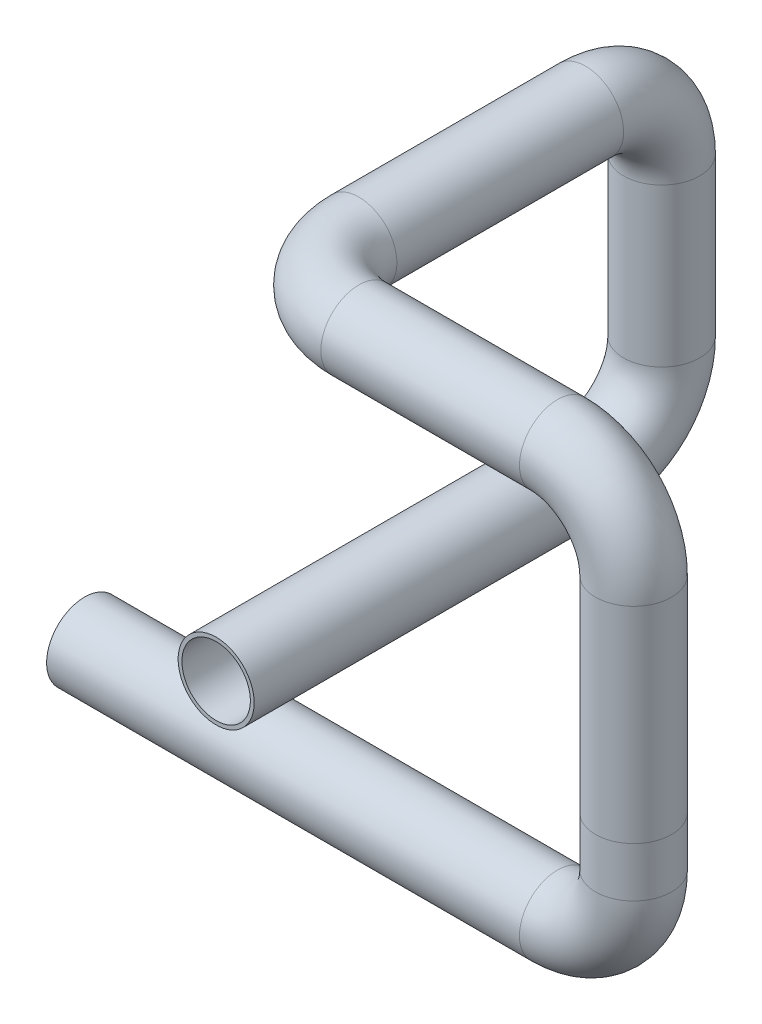
ISO-10303-21;
HEADER;
FILE_DESCRIPTION(('STEP AP214'),'2;1');
FILE_NAME('part.step','',(''),(''),'','','');
FILE_SCHEMA(('AUTOMOTIVE_DESIGN { 1 0 10303 214 1 1 1 1 }'));
ENDSEC;
DATA;
#1=APPLICATION_CONTEXT('core data for automotive mechanical design processes');
#2=APPLICATION_PROTOCOL_DEFINITION('international standard','automotive_design',2000,#1);
#3=PRODUCT_CONTEXT('',#1,'mechanical');
#4=PRODUCT('Part','Part','',(#3));
#5=PRODUCT_RELATED_PRODUCT_CATEGORY('part','',(#4));
#6=PRODUCT_DEFINITION_FORMATION('','',#4);
#7=PRODUCT_DEFINITION_CONTEXT('part definition',#1,'design');
#8=PRODUCT_DEFINITION('design','',#6,#7);
#9=PRODUCT_DEFINITION_SHAPE('','',#8);
#10=(LENGTH_UNIT() NAMED_UNIT(*) SI_UNIT(.MILLI.,.METRE.));
#11=(NAMED_UNIT(*) PLANE_ANGLE_UNIT() SI_UNIT($,.RADIAN.));
#12=(NAMED_UNIT(*) SI_UNIT($,.STERADIAN.) SOLID_ANGLE_UNIT());
#13=UNCERTAINTY_MEASURE_WITH_UNIT(LENGTH_MEASURE(1.E-05),#10,'distance_accuracy_value','');
#14=(GEOMETRIC_REPRESENTATION_CONTEXT(3) GLOBAL_UNCERTAINTY_ASSIGNED_CONTEXT((#13)) GLOBAL_UNIT_ASSIGNED_CONTEXT((#10,
#11,#12)) REPRESENTATION_CONTEXT('',''));
#15=CARTESIAN_POINT('',(0.,0.,0.));
#16=DIRECTION('',(0.,0.,1.));
#17=DIRECTION('',(1.,0.,0.));
#18=AXIS2_PLACEMENT_3D('',#15,#16,#17);
#19=CARTESIAN_POINT('',(0.,0.,0.));
#20=DIRECTION('',(0.,0.,-1.));
#21=DIRECTION('',(0.,1.,0.));
#22=AXIS2_PLACEMENT_3D('',#19,#20,#21);
#23=PLANE('',#22);
#24=CARTESIAN_POINT('',(0.,0.,0.));
#25=DIRECTION('',(0.,0.,-1.));
#26=DIRECTION('',(0.,1.,0.));
#27=AXIS2_PLACEMENT_3D('',#24,#25,#26);
#28=CIRCLE('',#27,4.5);
#29=CARTESIAN_POINT('',(0.,4.5,0.));
#30=VERTEX_POINT('',#29);
#31=EDGE_CURVE('E117',#30,#30,#28,.T.);
#32=ORIENTED_EDGE('',*,*,#31,.T.);
#33=EDGE_LOOP('',(#32));
#34=FACE_BOUND('',#33,.T.);
#35=CARTESIAN_POINT('',(0.,0.,0.));
#36=DIRECTION('',(0.,0.,-1.));
#37=DIRECTION('',(0.,1.,0.));
#38=AXIS2_PLACEMENT_3D('',#35,#36,#37);
#39=CIRCLE('',#38,5.);
#40=CARTESIAN_POINT('',(0.,5.,0.));
#41=VERTEX_POINT('',#40);
#42=EDGE_CURVE('E108',#41,#41,#39,.T.);
#43=ORIENTED_EDGE('',*,*,#42,.F.);
#44=EDGE_LOOP('',(#43));
#45=FACE_BOUND('',#44,.T.);
#46=ADVANCED_FACE('F53',(#34,#45),#23,.F.);
#47=CARTESIAN_POINT('',(-26.0470045787997,-12.8350139714826,-8.76048561855214));
#48=DIRECTION('',(-1.,0.,0.));
#49=DIRECTION('',(0.,1.,0.));
#50=AXIS2_PLACEMENT_3D('',#47,#48,#49);
#51=PLANE('',#50);
#52=CARTESIAN_POINT('',(-26.0470045787997,-12.8350139714826,-8.76048561855214));
#53=DIRECTION('',(-1.,0.,0.));
#54=DIRECTION('',(0.,-1.,0.));
#55=AXIS2_PLACEMENT_3D('',#52,#53,#54);
#56=CIRCLE('',#55,4.5);
#57=CARTESIAN_POINT('',(-26.0470045787997,-17.3350139714826,-8.76048561855214));
#58=VERTEX_POINT('',#57);
#59=EDGE_CURVE('E112',#58,#58,#56,.T.);
#60=ORIENTED_EDGE('',*,*,#59,.F.);
#61=EDGE_LOOP('',(#60));
#62=FACE_BOUND('',#61,.T.);
#63=CARTESIAN_POINT('',(-26.0470045787997,-12.8350139714826,-8.76048561855214));
#64=DIRECTION('',(-1.,0.,0.));
#65=DIRECTION('',(0.,1.,0.));
#66=AXIS2_PLACEMENT_3D('',#63,#64,#65);
#67=CIRCLE('',#66,5.);
#68=CARTESIAN_POINT('',(-26.0470045787997,-7.83501397148257,-8.76048561855214));
#69=VERTEX_POINT('',#68);
#70=EDGE_CURVE('E11',#69,#69,#67,.T.);
#71=ORIENTED_EDGE('',*,*,#70,.T.);
#72=EDGE_LOOP('',(#71));
#73=FACE_BOUND('',#72,.T.);
#74=ADVANCED_FACE('F193',(#62,#73),#51,.T.);
#75=CARTESIAN_POINT('',(0.,0.,0.));
#76=DIRECTION('',(0.,0.,-1.));
#77=DIRECTION('',(0.,1.,0.));
#78=AXIS2_PLACEMENT_3D('',#75,#76,#77);
#79=CYLINDRICAL_SURFACE('',#78,5.);
#80=CARTESIAN_POINT('',(0.,0.,-48.5618707582967));
#81=DIRECTION('',(0.,0.,-1.));
#82=DIRECTION('',(0.,1.,0.));
#83=AXIS2_PLACEMENT_3D('',#80,#81,#82);
#84=CIRCLE('',#83,5.);
#85=CARTESIAN_POINT('',(0.,-5.,-48.5618707582967));
#86=VERTEX_POINT('',#85);
#87=EDGE_CURVE('E104',#86,#86,#84,.T.);
#88=ORIENTED_EDGE('',*,*,#87,.F.);
#89=EDGE_LOOP('',(#88));
#90=FACE_BOUND('',#89,.T.);
#91=ORIENTED_EDGE('',*,*,#42,.T.);
#92=EDGE_LOOP('',(#91));
#93=FACE_BOUND('',#92,.T.);
#94=ADVANCED_FACE('F195',(#90,#93),#79,.T.);
#95=CARTESIAN_POINT('',(0.,10.,-48.5618707582967));
#96=DIRECTION('',(1.,0.,0.));
#97=DIRECTION('',(0.,0.,-1.));
#98=AXIS2_PLACEMENT_3D('',#95,#96,#97);
#99=TOROIDAL_SURFACE('',#98,10.,5.);
#100=CARTESIAN_POINT('',(0.,10.,-58.5618707582967));
#101=DIRECTION('',(0.,1.,0.));
#102=DIRECTION('',(0.,0.,1.));
#103=AXIS2_PLACEMENT_3D('',#100,#101,#102);
#104=CIRCLE('',#103,5.);
#105=CARTESIAN_POINT('',(0.,10.,-63.5618707582967));
#106=VERTEX_POINT('',#105);
#107=EDGE_CURVE('E100',#106,#106,#104,.T.);
#108=CARTESIAN_POINT('',(0.,10.,-48.5618707582967));
#109=DIRECTION('',(1.,0.,0.));
#110=DIRECTION('',(0.,0.,-1.));
#111=AXIS2_PLACEMENT_3D('',#108,#109,#110);
#112=CIRCLE('',#111,15.);
#113=EDGE_CURVE('',#86,#106,#112,.T.);
#114=ORIENTED_EDGE('',*,*,#87,.T.);
#115=ORIENTED_EDGE('',*,*,#107,.F.);
#116=ORIENTED_EDGE('',*,*,#113,.T.);
#117=ORIENTED_EDGE('',*,*,#113,.F.);
#118=EDGE_LOOP('',(#114,#116,#115,#117));
#119=FACE_BOUND('',#118,.T.);
#120=ADVANCED_FACE('F201',(#119),#99,.T.);
#121=CARTESIAN_POINT('',(0.,10.,-58.5618707582967));
#122=DIRECTION('',(0.,1.,0.));
#123=DIRECTION('',(0.,0.,1.));
#124=AXIS2_PLACEMENT_3D('',#121,#122,#123);
#125=CYLINDRICAL_SURFACE('',#124,5.);
#126=CARTESIAN_POINT('',(0.,30.7185739143756,-58.5618707582967));
#127=DIRECTION('',(0.,1.,0.));
#128=DIRECTION('',(0.,0.,1.));
#129=AXIS2_PLACEMENT_3D('',#126,#127,#128);
#130=CIRCLE('',#129,5.);
#131=CARTESIAN_POINT('',(0.,30.7185739143756,-63.5618707582967));
#132=VERTEX_POINT('',#131);
#133=EDGE_CURVE('E96',#132,#132,#130,.T.);
#134=ORIENTED_EDGE('',*,*,#133,.F.);
#135=EDGE_LOOP('',(#134));
#136=FACE_BOUND('',#135,.T.);
#137=ORIENTED_EDGE('',*,*,#107,.T.);
#138=EDGE_LOOP('',(#137));
#139=FACE_BOUND('',#138,.T.);
#140=ADVANCED_FACE('F266',(#136,#139),#125,.T.);
#141=CARTESIAN_POINT('',(0.,30.7185739143756,-48.5618707582967));
#142=DIRECTION('',(1.,0.,0.));
#143=DIRECTION('',(0.,0.,-1.));
#144=AXIS2_PLACEMENT_3D('',#141,#142,#143);
#145=TOROIDAL_SURFACE('',#144,10.,5.);
#146=CARTESIAN_POINT('',(0.,40.7185739143756,-48.5618707582967));
#147=DIRECTION('',(0.,0.,1.));
#148=DIRECTION('',(0.,-1.,0.));
#149=AXIS2_PLACEMENT_3D('',#146,#147,#148);
#150=CIRCLE('',#149,5.);
#151=CARTESIAN_POINT('',(0.,45.7185739143756,-48.5618707582967));
#152=VERTEX_POINT('',#151);
#153=EDGE_CURVE('E92',#152,#152,#150,.T.);
#154=CARTESIAN_POINT('',(0.,30.7185739143756,-48.5618707582967));
#155=DIRECTION('',(1.,0.,0.));
#156=DIRECTION('',(0.,0.,-1.));
#157=AXIS2_PLACEMENT_3D('',#154,#155,#156);
#158=CIRCLE('',#157,15.);
#159=EDGE_CURVE('',#132,#152,#158,.T.);
#160=ORIENTED_EDGE('',*,*,#133,.T.);
#161=ORIENTED_EDGE('',*,*,#153,.F.);
#162=ORIENTED_EDGE('',*,*,#159,.T.);
#163=ORIENTED_EDGE('',*,*,#159,.F.);
#164=EDGE_LOOP('',(#160,#162,#161,#163));
#165=FACE_BOUND('',#164,.T.);
#166=ADVANCED_FACE('F270',(#165),#145,.T.);
#167=CARTESIAN_POINT('',(0.,40.7185739143756,-48.5618707582967));
#168=DIRECTION('',(0.,0.,1.));
#169=DIRECTION('',(1.,0.,0.));
#170=AXIS2_PLACEMENT_3D('',#167,#168,#169);
#171=CYLINDRICAL_SURFACE('',#170,5.);
#172=CARTESIAN_POINT('',(0.,40.7185739143756,-18.7604856185521));
#173=DIRECTION('',(0.,0.,1.));
#174=DIRECTION('',(0.,-1.,0.));
#175=AXIS2_PLACEMENT_3D('',#172,#173,#174);
#176=CIRCLE('',#175,5.);
#177=CARTESIAN_POINT('',(-5.,40.7185739143756,-18.7604856185521));
#178=VERTEX_POINT('',#177);
#179=EDGE_CURVE('E88',#178,#178,#176,.T.);
#180=ORIENTED_EDGE('',*,*,#179,.F.);
#181=EDGE_LOOP('',(#180));
#182=FACE_BOUND('',#181,.T.);
#183=ORIENTED_EDGE('',*,*,#153,.T.);
#184=EDGE_LOOP('',(#183));
#185=FACE_BOUND('',#184,.T.);
#186=ADVANCED_FACE('F274',(#182,#185),#171,.T.);
#187=CARTESIAN_POINT('',(10.,40.7185739143756,-18.7604856185521));
#188=DIRECTION('',(0.,1.,0.));
#189=DIRECTION('',(0.,0.,1.));
#190=AXIS2_PLACEMENT_3D('',#187,#188,#189);
#191=TOROIDAL_SURFACE('',#190,10.,5.);
#192=CARTESIAN_POINT('',(10.,40.7185739143756,-8.76048561855214));
#193=DIRECTION('',(1.,0.,0.));
#194=DIRECTION('',(0.,-1.,0.));
#195=AXIS2_PLACEMENT_3D('',#192,#193,#194);
#196=CIRCLE('',#195,5.);
#197=CARTESIAN_POINT('',(10.,40.7185739143756,-3.76048561855214));
#198=VERTEX_POINT('',#197);
#199=EDGE_CURVE('E84',#198,#198,#196,.T.);
#200=CARTESIAN_POINT('',(10.,40.7185739143756,-18.7604856185521));
#201=DIRECTION('',(0.,1.,0.));
#202=DIRECTION('',(0.,0.,1.));
#203=AXIS2_PLACEMENT_3D('',#200,#201,#202);
#204=CIRCLE('',#203,15.);
#205=EDGE_CURVE('',#178,#198,#204,.T.);
#206=ORIENTED_EDGE('',*,*,#179,.T.);
#207=ORIENTED_EDGE('',*,*,#199,.F.);
#208=ORIENTED_EDGE('',*,*,#205,.T.);
#209=ORIENTED_EDGE('',*,*,#205,.F.);
#210=EDGE_LOOP('',(#206,#208,#207,#209));
#211=FACE_BOUND('',#210,.T.);
#212=ADVANCED_FACE('F278',(#211),#191,.T.);
#213=CARTESIAN_POINT('',(10.,40.7185739143756,-8.76048561855214));
#214=DIRECTION('',(1.,0.,0.));
#215=DIRECTION('',(0.,0.,-1.));
#216=AXIS2_PLACEMENT_3D('',#213,#214,#215);
#217=CYLINDRICAL_SURFACE('',#216,5.);
#218=CARTESIAN_POINT('',(36.112465609383,40.7185739143756,-8.76048561855214));
#219=DIRECTION('',(1.,0.,0.));
#220=DIRECTION('',(0.,-1.,0.));
#221=AXIS2_PLACEMENT_3D('',#218,#219,#220);
#222=CIRCLE('',#221,5.);
#223=CARTESIAN_POINT('',(36.112465609383,45.7185739143756,-8.76048561855214));
#224=VERTEX_POINT('',#223);
#225=EDGE_CURVE('E80',#224,#224,#222,.T.);
#226=ORIENTED_EDGE('',*,*,#225,.F.);
#227=EDGE_LOOP('',(#226));
#228=FACE_BOUND('',#227,.T.);
#229=ORIENTED_EDGE('',*,*,#199,.T.);
#230=EDGE_LOOP('',(#229));
#231=FACE_BOUND('',#230,.T.);
#232=ADVANCED_FACE('F282',(#228,#231),#217,.T.);
#233=CARTESIAN_POINT('',(36.112465609383,30.7185739143756,-8.76048561855214));
#234=DIRECTION('',(0.,0.,-1.));
#235=DIRECTION('',(-1.,0.,0.));
#236=AXIS2_PLACEMENT_3D('',#233,#234,#235);
#237=TOROIDAL_SURFACE('',#236,10.,5.);
#238=CARTESIAN_POINT('',(46.112465609383,30.7185739143756,-8.76048561855214));
#239=DIRECTION('',(0.,-1.,0.));
#240=DIRECTION('',(-1.,0.,0.));
#241=AXIS2_PLACEMENT_3D('',#238,#239,#240);
#242=CIRCLE('',#241,5.);
#243=CARTESIAN_POINT('',(51.112465609383,30.7185739143756,-8.76048561855214));
#244=VERTEX_POINT('',#243);
#245=EDGE_CURVE('E76',#244,#244,#242,.T.);
#246=CARTESIAN_POINT('',(36.112465609383,30.7185739143756,-8.76048561855214));
#247=DIRECTION('',(0.,0.,-1.));
#248=DIRECTION('',(-1.,0.,0.));
#249=AXIS2_PLACEMENT_3D('',#246,#247,#248);
#250=CIRCLE('',#249,15.);
#251=EDGE_CURVE('',#224,#244,#250,.T.);
#252=ORIENTED_EDGE('',*,*,#225,.T.);
#253=ORIENTED_EDGE('',*,*,#245,.F.);
#254=ORIENTED_EDGE('',*,*,#251,.T.);
#255=ORIENTED_EDGE('',*,*,#251,.F.);
#256=EDGE_LOOP('',(#252,#254,#253,#255));
#257=FACE_BOUND('',#256,.T.);
#258=ADVANCED_FACE('F286',(#257),#237,.T.);
#259=CARTESIAN_POINT('',(46.112465609383,30.7185739143756,-8.76048561855214));
#260=DIRECTION('',(0.,-1.,0.));
#261=DIRECTION('',(0.,0.,-1.));
#262=AXIS2_PLACEMENT_3D('',#259,#260,#261);
#263=CYLINDRICAL_SURFACE('',#262,5.);
#264=CARTESIAN_POINT('',(46.112465609383,3.70351457729612,-8.76048561855214));
#265=DIRECTION('',(0.,-1.,0.));
#266=DIRECTION('',(-1.,0.,0.));
#267=AXIS2_PLACEMENT_3D('',#264,#265,#266);
#268=CIRCLE('',#267,5.);
#269=CARTESIAN_POINT('',(41.112465609383,3.70351457729612,-8.76048561855214));
#270=VERTEX_POINT('',#269);
#271=EDGE_CURVE('E70',#270,#270,#268,.T.);
#272=ORIENTED_EDGE('',*,*,#271,.F.);
#273=EDGE_LOOP('',(#272));
#274=FACE_BOUND('',#273,.T.);
#275=ORIENTED_EDGE('',*,*,#245,.T.);
#276=EDGE_LOOP('',(#275));
#277=FACE_BOUND('',#276,.T.);
#278=ADVANCED_FACE('F290',(#274,#277),#263,.T.);
#279=CARTESIAN_POINT('',(46.112465609383,3.70351457729612,-8.76048561855214));
#280=DIRECTION('',(0.,-1.,0.));
#281=DIRECTION('',(0.,0.,-1.));
#282=AXIS2_PLACEMENT_3D('',#279,#280,#281);
#283=CYLINDRICAL_SURFACE('',#282,5.);
#284=CARTESIAN_POINT('',(46.112465609383,-2.83501397148257,-8.76048561855214));
#285=DIRECTION('',(0.,-1.,0.));
#286=DIRECTION('',(-1.,0.,0.));
#287=AXIS2_PLACEMENT_3D('',#284,#285,#286);
#288=CIRCLE('',#287,5.);
#289=CARTESIAN_POINT('',(51.112465609383,-2.83501397148257,-8.76048561855214));
#290=VERTEX_POINT('',#289);
#291=EDGE_CURVE('E65',#290,#290,#288,.T.);
#292=ORIENTED_EDGE('',*,*,#291,.F.);
#293=EDGE_LOOP('',(#292));
#294=FACE_BOUND('',#293,.T.);
#295=ORIENTED_EDGE('',*,*,#271,.T.);
#296=EDGE_LOOP('',(#295));
#297=FACE_BOUND('',#296,.T.);
#298=ADVANCED_FACE('F189',(#294,#297),#283,.T.);
#299=CARTESIAN_POINT('',(36.112465609383,-2.83501397148257,-8.76048561855214));
#300=DIRECTION('',(0.,0.,-1.));
#301=DIRECTION('',(-1.,0.,0.));
#302=AXIS2_PLACEMENT_3D('',#299,#300,#301);
#303=TOROIDAL_SURFACE('',#302,10.,5.);
#304=CARTESIAN_POINT('',(36.112465609383,-12.8350139714826,-8.76048561855214));
#305=DIRECTION('',(-1.,0.,0.));
#306=DIRECTION('',(0.,1.,0.));
#307=AXIS2_PLACEMENT_3D('',#304,#305,#306);
#308=CIRCLE('',#307,5.);
#309=CARTESIAN_POINT('',(36.112465609383,-17.8350139714826,-8.76048561855214));
#310=VERTEX_POINT('',#309);
#311=EDGE_CURVE('E60',#310,#310,#308,.T.);
#312=CARTESIAN_POINT('',(36.112465609383,-2.83501397148257,-8.76048561855214));
#313=DIRECTION('',(0.,0.,-1.));
#314=DIRECTION('',(-1.,0.,0.));
#315=AXIS2_PLACEMENT_3D('',#312,#313,#314);
#316=CIRCLE('',#315,15.);
#317=EDGE_CURVE('',#290,#310,#316,.T.);
#318=ORIENTED_EDGE('',*,*,#291,.T.);
#319=ORIENTED_EDGE('',*,*,#311,.F.);
#320=ORIENTED_EDGE('',*,*,#317,.T.);
#321=ORIENTED_EDGE('',*,*,#317,.F.);
#322=EDGE_LOOP('',(#318,#320,#319,#321));
#323=FACE_BOUND('',#322,.T.);
#324=ADVANCED_FACE('F183',(#323),#303,.T.);
#325=CARTESIAN_POINT('',(36.112465609383,-12.8350139714826,-8.76048561855214));
#326=DIRECTION('',(-1.,0.,0.));
#327=DIRECTION('',(0.,0.,1.));
#328=AXIS2_PLACEMENT_3D('',#325,#326,#327);
#329=CYLINDRICAL_SURFACE('',#328,5.);
#330=ORIENTED_EDGE('',*,*,#70,.F.);
#331=EDGE_LOOP('',(#330));
#332=FACE_BOUND('',#331,.T.);
#333=ORIENTED_EDGE('',*,*,#311,.T.);
#334=EDGE_LOOP('',(#333));
#335=FACE_BOUND('',#334,.T.);
#336=ADVANCED_FACE('F180',(#332,#335),#329,.T.);
#337=CARTESIAN_POINT('',(0.,0.,0.));
#338=DIRECTION('',(0.,0.,-1.));
#339=DIRECTION('',(0.,1.,0.));
#340=AXIS2_PLACEMENT_3D('',#337,#338,#339);
#341=CYLINDRICAL_SURFACE('',#340,4.5);
#342=CARTESIAN_POINT('',(0.,0.,-48.5618707582967));
#343=DIRECTION('',(0.,0.,1.));
#344=DIRECTION('',(0.,-1.,0.));
#345=AXIS2_PLACEMENT_3D('',#342,#343,#344);
#346=CIRCLE('',#345,4.5);
#347=CARTESIAN_POINT('',(0.,-4.5,-48.5618707582967));
#348=VERTEX_POINT('',#347);
#349=EDGE_CURVE('E121',#348,#348,#346,.F.);
#350=ORIENTED_EDGE('',*,*,#349,.T.);
#351=EDGE_LOOP('',(#350));
#352=FACE_BOUND('',#351,.T.);
#353=ORIENTED_EDGE('',*,*,#31,.F.);
#354=EDGE_LOOP('',(#353));
#355=FACE_BOUND('',#354,.T.);
#356=ADVANCED_FACE('F165',(#352,#355),#341,.F.);
#357=CARTESIAN_POINT('',(0.,10.,-48.5618707582967));
#358=DIRECTION('',(1.,0.,0.));
#359=DIRECTION('',(0.,0.,-1.));
#360=AXIS2_PLACEMENT_3D('',#357,#358,#359);
#361=TOROIDAL_SURFACE('',#360,10.,4.5);
#362=CARTESIAN_POINT('',(0.,10.,-58.5618707582967));
#363=DIRECTION('',(0.,1.,0.));
#364=DIRECTION('',(0.,0.,1.));
#365=AXIS2_PLACEMENT_3D('',#362,#363,#364);
#366=CIRCLE('',#365,4.5);
#367=CARTESIAN_POINT('',(0.,10.,-63.0618707582967));
#368=VERTEX_POINT('',#367);
#369=EDGE_CURVE('E157',#368,#368,#366,.T.);
#370=CARTESIAN_POINT('',(0.,10.,-48.5618707582967));
#371=DIRECTION('',(1.,0.,0.));
#372=DIRECTION('',(0.,0.,-1.));
#373=AXIS2_PLACEMENT_3D('',#370,#371,#372);
#374=CIRCLE('',#373,14.5);
#375=EDGE_CURVE('',#348,#368,#374,.T.);
#376=ORIENTED_EDGE('',*,*,#349,.F.);
#377=ORIENTED_EDGE('',*,*,#369,.T.);
#378=ORIENTED_EDGE('',*,*,#375,.T.);
#379=ORIENTED_EDGE('',*,*,#375,.F.);
#380=EDGE_LOOP('',(#376,#378,#377,#379));
#381=FACE_BOUND('',#380,.T.);
#382=ADVANCED_FACE('F168',(#381),#361,.F.);
#383=CARTESIAN_POINT('',(0.,10.,-58.5618707582967));
#384=DIRECTION('',(0.,1.,0.));
#385=DIRECTION('',(0.,0.,1.));
#386=AXIS2_PLACEMENT_3D('',#383,#384,#385);
#387=CYLINDRICAL_SURFACE('',#386,4.5);
#388=CARTESIAN_POINT('',(0.,30.7185739143756,-58.5618707582967));
#389=DIRECTION('',(0.,-1.,0.));
#390=DIRECTION('',(0.,0.,-1.));
#391=AXIS2_PLACEMENT_3D('',#388,#389,#390);
#392=CIRCLE('',#391,4.5);
#393=CARTESIAN_POINT('',(0.,30.7185739143756,-63.0618707582967));
#394=VERTEX_POINT('',#393);
#395=EDGE_CURVE('E153',#394,#394,#392,.F.);
#396=ORIENTED_EDGE('',*,*,#395,.T.);
#397=EDGE_LOOP('',(#396));
#398=FACE_BOUND('',#397,.T.);
#399=ORIENTED_EDGE('',*,*,#369,.F.);
#400=EDGE_LOOP('',(#399));
#401=FACE_BOUND('',#400,.T.);
#402=ADVANCED_FACE('F170',(#398,#401),#387,.F.);
#403=CARTESIAN_POINT('',(0.,30.7185739143756,-48.5618707582967));
#404=DIRECTION('',(1.,0.,0.));
#405=DIRECTION('',(0.,0.,-1.));
#406=AXIS2_PLACEMENT_3D('',#403,#404,#405);
#407=TOROIDAL_SURFACE('',#406,10.,4.5);
#408=CARTESIAN_POINT('',(0.,40.7185739143756,-48.5618707582967));
#409=DIRECTION('',(0.,0.,1.));
#410=DIRECTION('',(1.,0.,0.));
#411=AXIS2_PLACEMENT_3D('',#408,#409,#410);
#412=CIRCLE('',#411,4.5);
#413=CARTESIAN_POINT('',(0.,45.2185739143756,-48.5618707582967));
#414=VERTEX_POINT('',#413);
#415=EDGE_CURVE('E149',#414,#414,#412,.T.);
#416=CARTESIAN_POINT('',(0.,30.7185739143756,-48.5618707582967));
#417=DIRECTION('',(1.,0.,0.));
#418=DIRECTION('',(0.,0.,-1.));
#419=AXIS2_PLACEMENT_3D('',#416,#417,#418);
#420=CIRCLE('',#419,14.5);
#421=EDGE_CURVE('',#394,#414,#420,.T.);
#422=ORIENTED_EDGE('',*,*,#395,.F.);
#423=ORIENTED_EDGE('',*,*,#415,.T.);
#424=ORIENTED_EDGE('',*,*,#421,.T.);
#425=ORIENTED_EDGE('',*,*,#421,.F.);
#426=EDGE_LOOP('',(#422,#424,#423,#425));
#427=FACE_BOUND('',#426,.T.);
#428=ADVANCED_FACE('F177',(#427),#407,.F.);
#429=CARTESIAN_POINT('',(0.,40.7185739143756,-48.5618707582967));
#430=DIRECTION('',(0.,0.,1.));
#431=DIRECTION('',(1.,0.,0.));
#432=AXIS2_PLACEMENT_3D('',#429,#430,#431);
#433=CYLINDRICAL_SURFACE('',#432,4.5);
#434=CARTESIAN_POINT('',(0.,40.7185739143756,-18.7604856185521));
#435=DIRECTION('',(0.,0.,-1.));
#436=DIRECTION('',(-1.,0.,0.));
#437=AXIS2_PLACEMENT_3D('',#434,#435,#436);
#438=CIRCLE('',#437,4.5);
#439=CARTESIAN_POINT('',(-4.5,40.7185739143756,-18.7604856185521));
#440=VERTEX_POINT('',#439);
#441=EDGE_CURVE('E145',#440,#440,#438,.F.);
#442=ORIENTED_EDGE('',*,*,#441,.T.);
#443=EDGE_LOOP('',(#442));
#444=FACE_BOUND('',#443,.T.);
#445=ORIENTED_EDGE('',*,*,#415,.F.);
#446=EDGE_LOOP('',(#445));
#447=FACE_BOUND('',#446,.T.);
#448=ADVANCED_FACE('F246',(#444,#447),#433,.F.);
#449=CARTESIAN_POINT('',(10.,40.7185739143756,-18.7604856185521));
#450=DIRECTION('',(0.,1.,0.));
#451=DIRECTION('',(0.,0.,1.));
#452=AXIS2_PLACEMENT_3D('',#449,#450,#451);
#453=TOROIDAL_SURFACE('',#452,10.,4.5);
#454=CARTESIAN_POINT('',(10.,40.7185739143756,-8.76048561855214));
#455=DIRECTION('',(1.,0.,0.));
#456=DIRECTION('',(0.,0.,-1.));
#457=AXIS2_PLACEMENT_3D('',#454,#455,#456);
#458=CIRCLE('',#457,4.5);
#459=CARTESIAN_POINT('',(10.,40.7185739143756,-4.26048561855214));
#460=VERTEX_POINT('',#459);
#461=EDGE_CURVE('E141',#460,#460,#458,.T.);
#462=CARTESIAN_POINT('',(10.,40.7185739143756,-18.7604856185521));
#463=DIRECTION('',(0.,1.,0.));
#464=DIRECTION('',(0.,0.,1.));
#465=AXIS2_PLACEMENT_3D('',#462,#463,#464);
#466=CIRCLE('',#465,14.5);
#467=EDGE_CURVE('',#440,#460,#466,.T.);
#468=ORIENTED_EDGE('',*,*,#441,.F.);
#469=ORIENTED_EDGE('',*,*,#461,.T.);
#470=ORIENTED_EDGE('',*,*,#467,.T.);
#471=ORIENTED_EDGE('',*,*,#467,.F.);
#472=EDGE_LOOP('',(#468,#470,#469,#471));
#473=FACE_BOUND('',#472,.T.);
#474=ADVANCED_FACE('F240',(#473),#453,.F.);
#475=CARTESIAN_POINT('',(10.,40.7185739143756,-8.76048561855214));
#476=DIRECTION('',(1.,0.,0.));
#477=DIRECTION('',(0.,0.,-1.));
#478=AXIS2_PLACEMENT_3D('',#475,#476,#477);
#479=CYLINDRICAL_SURFACE('',#478,4.5);
#480=CARTESIAN_POINT('',(36.112465609383,40.7185739143756,-8.76048561855214));
#481=DIRECTION('',(-1.,0.,0.));
#482=DIRECTION('',(0.,-1.,0.));
#483=AXIS2_PLACEMENT_3D('',#480,#481,#482);
#484=CIRCLE('',#483,4.5);
#485=CARTESIAN_POINT('',(36.112465609383,45.2185739143756,-8.76048561855214));
#486=VERTEX_POINT('',#485);
#487=EDGE_CURVE('E137',#486,#486,#484,.F.);
#488=ORIENTED_EDGE('',*,*,#487,.T.);
#489=EDGE_LOOP('',(#488));
#490=FACE_BOUND('',#489,.T.);
#491=ORIENTED_EDGE('',*,*,#461,.F.);
#492=EDGE_LOOP('',(#491));
#493=FACE_BOUND('',#492,.T.);
#494=ADVANCED_FACE('F234',(#490,#493),#479,.F.);
#495=CARTESIAN_POINT('',(36.112465609383,30.7185739143756,-8.76048561855214));
#496=DIRECTION('',(0.,0.,-1.));
#497=DIRECTION('',(-1.,0.,0.));
#498=AXIS2_PLACEMENT_3D('',#495,#496,#497);
#499=TOROIDAL_SURFACE('',#498,10.,4.5);
#500=CARTESIAN_POINT('',(46.112465609383,30.7185739143756,-8.76048561855214));
#501=DIRECTION('',(0.,-1.,0.));
#502=DIRECTION('',(0.,0.,-1.));
#503=AXIS2_PLACEMENT_3D('',#500,#501,#502);
#504=CIRCLE('',#503,4.5);
#505=CARTESIAN_POINT('',(50.612465609383,30.7185739143756,-8.76048561855214));
#506=VERTEX_POINT('',#505);
#507=EDGE_CURVE('E133',#506,#506,#504,.T.);
#508=CARTESIAN_POINT('',(36.112465609383,30.7185739143756,-8.76048561855214));
#509=DIRECTION('',(0.,0.,-1.));
#510=DIRECTION('',(-1.,0.,0.));
#511=AXIS2_PLACEMENT_3D('',#508,#509,#510);
#512=CIRCLE('',#511,14.5);
#513=EDGE_CURVE('',#486,#506,#512,.T.);
#514=ORIENTED_EDGE('',*,*,#487,.F.);
#515=ORIENTED_EDGE('',*,*,#507,.T.);
#516=ORIENTED_EDGE('',*,*,#513,.T.);
#517=ORIENTED_EDGE('',*,*,#513,.F.);
#518=EDGE_LOOP('',(#514,#516,#515,#517));
#519=FACE_BOUND('',#518,.T.);
#520=ADVANCED_FACE('F228',(#519),#499,.F.);
#521=CARTESIAN_POINT('',(46.112465609383,30.7185739143756,-8.76048561855214));
#522=DIRECTION('',(0.,-1.,0.));
#523=DIRECTION('',(0.,0.,-1.));
#524=AXIS2_PLACEMENT_3D('',#521,#522,#523);
#525=CYLINDRICAL_SURFACE('',#524,4.5);
#526=CARTESIAN_POINT('',(46.112465609383,3.70351457729612,-8.76048561855214));
#527=DIRECTION('',(0.,-1.,0.));
#528=DIRECTION('',(0.,0.,-1.));
#529=AXIS2_PLACEMENT_3D('',#526,#527,#528);
#530=CIRCLE('',#529,4.5);
#531=CARTESIAN_POINT('',(46.112465609383,3.70351457729612,-13.2604856185521));
#532=VERTEX_POINT('',#531);
#533=EDGE_CURVE('E129',#532,#532,#530,.T.);
#534=ORIENTED_EDGE('',*,*,#533,.T.);
#535=EDGE_LOOP('',(#534));
#536=FACE_BOUND('',#535,.T.);
#537=ORIENTED_EDGE('',*,*,#507,.F.);
#538=EDGE_LOOP('',(#537));
#539=FACE_BOUND('',#538,.T.);
#540=ADVANCED_FACE('F222',(#536,#539),#525,.F.);
#541=CARTESIAN_POINT('',(46.112465609383,3.70351457729612,-8.76048561855214));
#542=DIRECTION('',(0.,-1.,0.));
#543=DIRECTION('',(0.,0.,-1.));
#544=AXIS2_PLACEMENT_3D('',#541,#542,#543);
#545=CYLINDRICAL_SURFACE('',#544,4.5);
#546=CARTESIAN_POINT('',(46.112465609383,-2.83501397148257,-8.76048561855214));
#547=DIRECTION('',(0.,1.,0.));
#548=DIRECTION('',(-1.,0.,0.));
#549=AXIS2_PLACEMENT_3D('',#546,#547,#548);
#550=CIRCLE('',#549,4.5);
#551=CARTESIAN_POINT('',(50.612465609383,-2.83501397148257,-8.76048561855214));
#552=VERTEX_POINT('',#551);
#553=EDGE_CURVE('E125',#552,#552,#550,.F.);
#554=ORIENTED_EDGE('',*,*,#553,.T.);
#555=EDGE_LOOP('',(#554));
#556=FACE_BOUND('',#555,.T.);
#557=ORIENTED_EDGE('',*,*,#533,.F.);
#558=EDGE_LOOP('',(#557));
#559=FACE_BOUND('',#558,.T.);
#560=ADVANCED_FACE('F216',(#556,#559),#545,.F.);
#561=CARTESIAN_POINT('',(36.112465609383,-2.83501397148257,-8.76048561855214));
#562=DIRECTION('',(0.,0.,-1.));
#563=DIRECTION('',(-1.,0.,0.));
#564=AXIS2_PLACEMENT_3D('',#561,#562,#563);
#565=TOROIDAL_SURFACE('',#564,10.,4.5);
#566=CARTESIAN_POINT('',(36.112465609383,-12.8350139714826,-8.76048561855214));
#567=DIRECTION('',(-1.,0.,0.));
#568=DIRECTION('',(0.,0.,1.));
#569=AXIS2_PLACEMENT_3D('',#566,#567,#568);
#570=CIRCLE('',#569,4.5);
#571=CARTESIAN_POINT('',(36.112465609383,-17.3350139714826,-8.76048561855214));
#572=VERTEX_POINT('',#571);
#573=EDGE_CURVE('E116',#572,#572,#570,.T.);
#574=CARTESIAN_POINT('',(36.112465609383,-2.83501397148257,-8.76048561855214));
#575=DIRECTION('',(0.,0.,-1.));
#576=DIRECTION('',(-1.,0.,0.));
#577=AXIS2_PLACEMENT_3D('',#574,#575,#576);
#578=CIRCLE('',#577,14.5);
#579=EDGE_CURVE('',#552,#572,#578,.T.);
#580=ORIENTED_EDGE('',*,*,#553,.F.);
#581=ORIENTED_EDGE('',*,*,#573,.T.);
#582=ORIENTED_EDGE('',*,*,#579,.T.);
#583=ORIENTED_EDGE('',*,*,#579,.F.);
#584=EDGE_LOOP('',(#580,#582,#581,#583));
#585=FACE_BOUND('',#584,.T.);
#586=ADVANCED_FACE('F210',(#585),#565,.F.);
#587=CARTESIAN_POINT('',(36.112465609383,-12.8350139714826,-8.76048561855214));
#588=DIRECTION('',(-1.,0.,0.));
#589=DIRECTION('',(0.,0.,1.));
#590=AXIS2_PLACEMENT_3D('',#587,#588,#589);
#591=CYLINDRICAL_SURFACE('',#590,4.5);
#592=ORIENTED_EDGE('',*,*,#59,.T.);
#593=EDGE_LOOP('',(#592));
#594=FACE_BOUND('',#593,.T.);
#595=ORIENTED_EDGE('',*,*,#573,.F.);
#596=EDGE_LOOP('',(#595));
#597=FACE_BOUND('',#596,.T.);
#598=ADVANCED_FACE('F205',(#594,#597),#591,.F.);
#599=CLOSED_SHELL('',(#46,#74,#94,#120,#140,#166,#186,#212,#232,#258,#278,#298,#324,#336,#356,
#382,#402,#428,#448,#474,#494,#520,#540,#560,#586,#598));
#600=MANIFOLD_SOLID_BREP('B2',#599);
#601=ADVANCED_BREP_SHAPE_REPRESENTATION('',(#18,#600),#14);
#602=SHAPE_DEFINITION_REPRESENTATION(#9,#601);
ENDSEC;
END-ISO-10303-21;
